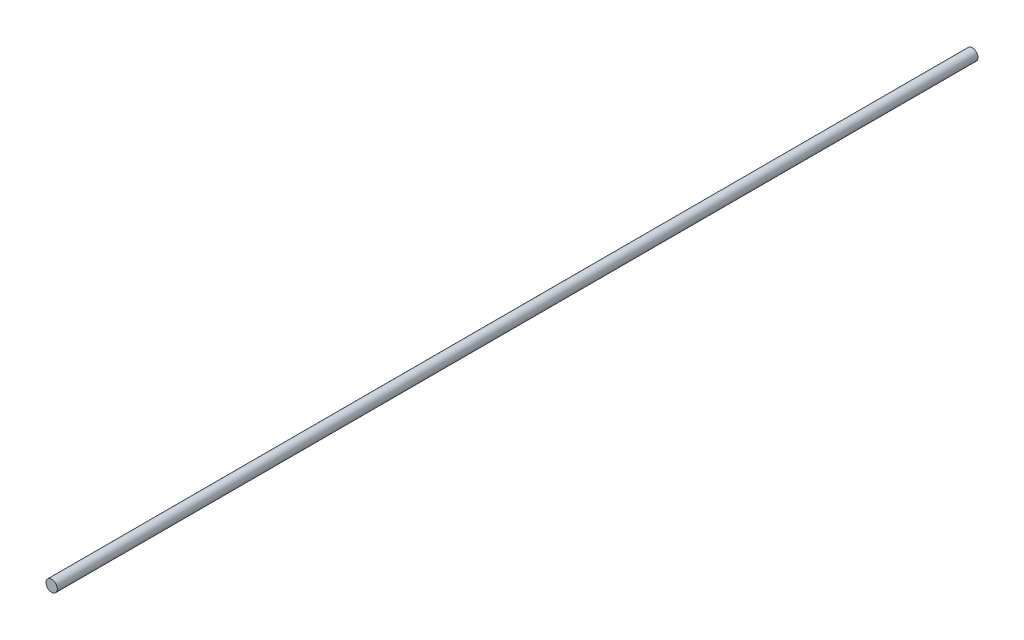
ISO-10303-21;
HEADER;
FILE_DESCRIPTION(('STEP AP214'),'2;1');
FILE_NAME('part.step','',(''),(''),'','','');
FILE_SCHEMA(('AUTOMOTIVE_DESIGN { 1 0 10303 214 1 1 1 1 }'));
ENDSEC;
DATA;
#1=APPLICATION_CONTEXT('core data for automotive mechanical design processes');
#2=APPLICATION_PROTOCOL_DEFINITION('international standard','automotive_design',2000,#1);
#3=PRODUCT_CONTEXT('',#1,'mechanical');
#4=PRODUCT('Part','Part','',(#3));
#5=PRODUCT_RELATED_PRODUCT_CATEGORY('part','',(#4));
#6=PRODUCT_DEFINITION_FORMATION('','',#4);
#7=PRODUCT_DEFINITION_CONTEXT('part definition',#1,'design');
#8=PRODUCT_DEFINITION('design','',#6,#7);
#9=PRODUCT_DEFINITION_SHAPE('','',#8);
#10=(LENGTH_UNIT() NAMED_UNIT(*) SI_UNIT(.MILLI.,.METRE.));
#11=(NAMED_UNIT(*) PLANE_ANGLE_UNIT() SI_UNIT($,.RADIAN.));
#12=(NAMED_UNIT(*) SI_UNIT($,.STERADIAN.) SOLID_ANGLE_UNIT());
#13=UNCERTAINTY_MEASURE_WITH_UNIT(LENGTH_MEASURE(1.E-05),#10,'distance_accuracy_value','');
#14=(GEOMETRIC_REPRESENTATION_CONTEXT(3) GLOBAL_UNCERTAINTY_ASSIGNED_CONTEXT((#13)) GLOBAL_UNIT_ASSIGNED_CONTEXT((#10,
#11,#12)) REPRESENTATION_CONTEXT('',''));
#15=CARTESIAN_POINT('',(0.,0.,0.));
#16=DIRECTION('',(0.,0.,1.));
#17=DIRECTION('',(1.,0.,0.));
#18=AXIS2_PLACEMENT_3D('',#15,#16,#17);
#19=CARTESIAN_POINT('',(0.,0.,650.));
#20=DIRECTION('',(0.,0.,-1.));
#21=DIRECTION('',(-1.,0.,0.));
#22=AXIS2_PLACEMENT_3D('',#19,#20,#21);
#23=CYLINDRICAL_SURFACE('',#22,4.);
#24=CARTESIAN_POINT('',(0.,0.,650.));
#25=DIRECTION('',(0.,0.,1.));
#26=DIRECTION('',(1.,0.,0.));
#27=AXIS2_PLACEMENT_3D('',#24,#25,#26);
#28=CIRCLE('',#27,4.);
#29=CARTESIAN_POINT('',(4.,0.,650.));
#30=VERTEX_POINT('',#29);
#31=EDGE_CURVE('E10',#30,#30,#28,.T.);
#32=ORIENTED_EDGE('',*,*,#31,.F.);
#33=EDGE_LOOP('',(#32));
#34=FACE_BOUND('',#33,.T.);
#35=CARTESIAN_POINT('',(0.,0.,0.));
#36=DIRECTION('',(0.,0.,1.));
#37=DIRECTION('',(1.,0.,0.));
#38=AXIS2_PLACEMENT_3D('',#35,#36,#37);
#39=CIRCLE('',#38,4.);
#40=CARTESIAN_POINT('',(4.,0.,0.));
#41=VERTEX_POINT('',#40);
#42=EDGE_CURVE('E34',#41,#41,#39,.T.);
#43=ORIENTED_EDGE('',*,*,#42,.T.);
#44=EDGE_LOOP('',(#43));
#45=FACE_BOUND('',#44,.T.);
#46=ADVANCED_FACE('F31',(#34,#45),#23,.T.);
#47=CARTESIAN_POINT('',(0.,0.,650.));
#48=DIRECTION('',(0.,0.,1.));
#49=DIRECTION('',(1.,0.,0.));
#50=AXIS2_PLACEMENT_3D('',#47,#48,#49);
#51=PLANE('',#50);
#52=ORIENTED_EDGE('',*,*,#31,.T.);
#53=EDGE_LOOP('',(#52));
#54=FACE_BOUND('',#53,.T.);
#55=ADVANCED_FACE('F46',(#54),#51,.T.);
#56=CARTESIAN_POINT('',(0.,0.,0.));
#57=DIRECTION('',(0.,0.,1.));
#58=DIRECTION('',(1.,0.,0.));
#59=AXIS2_PLACEMENT_3D('',#56,#57,#58);
#60=PLANE('',#59);
#61=ORIENTED_EDGE('',*,*,#42,.F.);
#62=EDGE_LOOP('',(#61));
#63=FACE_BOUND('',#62,.T.);
#64=ADVANCED_FACE('F44',(#63),#60,.F.);
#65=CLOSED_SHELL('',(#46,#55,#64));
#66=MANIFOLD_SOLID_BREP('B2',#65);
#67=ADVANCED_BREP_SHAPE_REPRESENTATION('',(#18,#66),#14);
#68=SHAPE_DEFINITION_REPRESENTATION(#9,#67);
ENDSEC;
END-ISO-10303-21;
